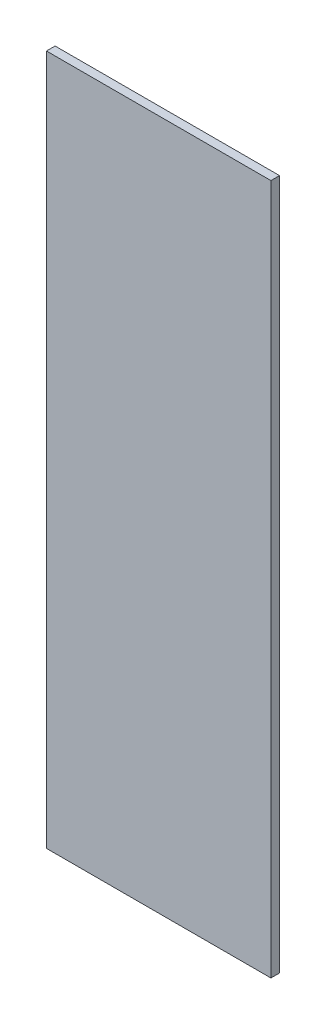
ISO-10303-21;
HEADER;
FILE_DESCRIPTION(('STEP AP214'),'2;1');
FILE_NAME('part.step','',(''),(''),'','','');
FILE_SCHEMA(('AUTOMOTIVE_DESIGN { 1 0 10303 214 1 1 1 1 }'));
ENDSEC;
DATA;
#1=APPLICATION_CONTEXT('core data for automotive mechanical design processes');
#2=APPLICATION_PROTOCOL_DEFINITION('international standard','automotive_design',2000,#1);
#3=PRODUCT_CONTEXT('',#1,'mechanical');
#4=PRODUCT('Part','Part','',(#3));
#5=PRODUCT_RELATED_PRODUCT_CATEGORY('part','',(#4));
#6=PRODUCT_DEFINITION_FORMATION('','',#4);
#7=PRODUCT_DEFINITION_CONTEXT('part definition',#1,'design');
#8=PRODUCT_DEFINITION('design','',#6,#7);
#9=PRODUCT_DEFINITION_SHAPE('','',#8);
#10=(LENGTH_UNIT() NAMED_UNIT(*) SI_UNIT(.MILLI.,.METRE.));
#11=(NAMED_UNIT(*) PLANE_ANGLE_UNIT() SI_UNIT($,.RADIAN.));
#12=(NAMED_UNIT(*) SI_UNIT($,.STERADIAN.) SOLID_ANGLE_UNIT());
#13=UNCERTAINTY_MEASURE_WITH_UNIT(LENGTH_MEASURE(1.E-05),#10,'distance_accuracy_value','');
#14=(GEOMETRIC_REPRESENTATION_CONTEXT(3) GLOBAL_UNCERTAINTY_ASSIGNED_CONTEXT((#13)) GLOBAL_UNIT_ASSIGNED_CONTEXT((#10,
#11,#12)) REPRESENTATION_CONTEXT('',''));
#15=CARTESIAN_POINT('',(0.,0.,0.));
#16=DIRECTION('',(0.,0.,1.));
#17=DIRECTION('',(1.,0.,0.));
#18=AXIS2_PLACEMENT_3D('',#15,#16,#17);
#19=CARTESIAN_POINT('',(-65.,-200.,5.));
#20=DIRECTION('',(1.,0.,0.));
#21=DIRECTION('',(0.,0.,-1.));
#22=AXIS2_PLACEMENT_3D('',#19,#20,#21);
#23=PLANE('',#22);
#24=DIRECTION('',(0.,-1.,0.));
#25=VECTOR('',#24,1.);
#26=CARTESIAN_POINT('',(-65.,-200.,0.));
#27=LINE('',#26,#25);
#28=CARTESIAN_POINT('',(-65.,200.,0.));
#29=VERTEX_POINT('',#28);
#30=CARTESIAN_POINT('',(-65.,-200.,0.));
#31=VERTEX_POINT('',#30);
#32=EDGE_CURVE('E100',#29,#31,#27,.T.);
#33=ORIENTED_EDGE('',*,*,#32,.T.);
#34=DIRECTION('',(0.,0.,-1.));
#35=VECTOR('',#34,1.);
#36=CARTESIAN_POINT('',(-65.,-200.,5.));
#37=LINE('',#36,#35);
#38=CARTESIAN_POINT('',(-65.,-200.,5.));
#39=VERTEX_POINT('',#38);
#40=EDGE_CURVE('E11',#39,#31,#37,.T.);
#41=ORIENTED_EDGE('',*,*,#40,.F.);
#42=DIRECTION('',(0.,-1.,0.));
#43=VECTOR('',#42,1.);
#44=CARTESIAN_POINT('',(-65.,-200.,5.));
#45=LINE('',#44,#43);
#46=CARTESIAN_POINT('',(-65.,200.,5.));
#47=VERTEX_POINT('',#46);
#48=EDGE_CURVE('E88',#47,#39,#45,.T.);
#49=ORIENTED_EDGE('',*,*,#48,.F.);
#50=DIRECTION('',(0.,0.,-1.));
#51=VECTOR('',#50,1.);
#52=CARTESIAN_POINT('',(-65.,200.,5.));
#53=LINE('',#52,#51);
#54=EDGE_CURVE('E96',#47,#29,#53,.T.);
#55=ORIENTED_EDGE('',*,*,#54,.T.);
#56=EDGE_LOOP('',(#33,#41,#49,#55));
#57=FACE_BOUND('',#56,.T.);
#58=ADVANCED_FACE('F37',(#57),#23,.F.);
#59=CARTESIAN_POINT('',(65.,-200.,5.));
#60=DIRECTION('',(0.,1.,0.));
#61=DIRECTION('',(0.,0.,1.));
#62=AXIS2_PLACEMENT_3D('',#59,#60,#61);
#63=PLANE('',#62);
#64=DIRECTION('',(1.,0.,0.));
#65=VECTOR('',#64,1.);
#66=CARTESIAN_POINT('',(65.,-200.,0.));
#67=LINE('',#66,#65);
#68=CARTESIAN_POINT('',(65.,-200.,0.));
#69=VERTEX_POINT('',#68);
#70=EDGE_CURVE('E92',#31,#69,#67,.T.);
#71=ORIENTED_EDGE('',*,*,#70,.T.);
#72=DIRECTION('',(0.,0.,-1.));
#73=VECTOR('',#72,1.);
#74=CARTESIAN_POINT('',(65.,-200.,5.));
#75=LINE('',#74,#73);
#76=CARTESIAN_POINT('',(65.,-200.,5.));
#77=VERTEX_POINT('',#76);
#78=EDGE_CURVE('E45',#77,#69,#75,.T.);
#79=ORIENTED_EDGE('',*,*,#78,.F.);
#80=DIRECTION('',(1.,0.,0.));
#81=VECTOR('',#80,1.);
#82=CARTESIAN_POINT('',(65.,-200.,5.));
#83=LINE('',#82,#81);
#84=EDGE_CURVE('E83',#39,#77,#83,.T.);
#85=ORIENTED_EDGE('',*,*,#84,.F.);
#86=ORIENTED_EDGE('',*,*,#40,.T.);
#87=EDGE_LOOP('',(#71,#79,#85,#86));
#88=FACE_BOUND('',#87,.T.);
#89=ADVANCED_FACE('F91',(#88),#63,.F.);
#90=CARTESIAN_POINT('',(65.,-200.,5.));
#91=DIRECTION('',(-1.,0.,0.));
#92=DIRECTION('',(0.,0.,1.));
#93=AXIS2_PLACEMENT_3D('',#90,#91,#92);
#94=PLANE('',#93);
#95=DIRECTION('',(0.,1.,0.));
#96=VECTOR('',#95,1.);
#97=CARTESIAN_POINT('',(65.,-200.,0.));
#98=LINE('',#97,#96);
#99=CARTESIAN_POINT('',(65.,200.,0.));
#100=VERTEX_POINT('',#99);
#101=EDGE_CURVE('E70',#69,#100,#98,.T.);
#102=ORIENTED_EDGE('',*,*,#101,.T.);
#103=DIRECTION('',(0.,0.,-1.));
#104=VECTOR('',#103,1.);
#105=CARTESIAN_POINT('',(65.,200.,5.));
#106=LINE('',#105,#104);
#107=CARTESIAN_POINT('',(65.,200.,5.));
#108=VERTEX_POINT('',#107);
#109=EDGE_CURVE('E93',#108,#100,#106,.T.);
#110=ORIENTED_EDGE('',*,*,#109,.F.);
#111=DIRECTION('',(0.,1.,0.));
#112=VECTOR('',#111,1.);
#113=CARTESIAN_POINT('',(65.,-200.,5.));
#114=LINE('',#113,#112);
#115=EDGE_CURVE('E86',#77,#108,#114,.T.);
#116=ORIENTED_EDGE('',*,*,#115,.F.);
#117=ORIENTED_EDGE('',*,*,#78,.T.);
#118=EDGE_LOOP('',(#102,#110,#116,#117));
#119=FACE_BOUND('',#118,.T.);
#120=ADVANCED_FACE('F94',(#119),#94,.F.);
#121=CARTESIAN_POINT('',(65.,200.,5.));
#122=DIRECTION('',(0.,-1.,0.));
#123=DIRECTION('',(0.,0.,-1.));
#124=AXIS2_PLACEMENT_3D('',#121,#122,#123);
#125=PLANE('',#124);
#126=DIRECTION('',(-1.,0.,0.));
#127=VECTOR('',#126,1.);
#128=CARTESIAN_POINT('',(65.,200.,0.));
#129=LINE('',#128,#127);
#130=EDGE_CURVE('E76',#100,#29,#129,.T.);
#131=ORIENTED_EDGE('',*,*,#130,.T.);
#132=ORIENTED_EDGE('',*,*,#54,.F.);
#133=DIRECTION('',(-1.,0.,0.));
#134=VECTOR('',#133,1.);
#135=CARTESIAN_POINT('',(65.,200.,5.));
#136=LINE('',#135,#134);
#137=EDGE_CURVE('E53',#108,#47,#136,.T.);
#138=ORIENTED_EDGE('',*,*,#137,.F.);
#139=ORIENTED_EDGE('',*,*,#109,.T.);
#140=EDGE_LOOP('',(#131,#132,#138,#139));
#141=FACE_BOUND('',#140,.T.);
#142=ADVANCED_FACE('F107',(#141),#125,.F.);
#143=CARTESIAN_POINT('',(0.,0.,5.));
#144=DIRECTION('',(0.,0.,1.));
#145=DIRECTION('',(1.,0.,0.));
#146=AXIS2_PLACEMENT_3D('',#143,#144,#145);
#147=PLANE('',#146);
#148=ORIENTED_EDGE('',*,*,#48,.T.);
#149=ORIENTED_EDGE('',*,*,#84,.T.);
#150=ORIENTED_EDGE('',*,*,#115,.T.);
#151=ORIENTED_EDGE('',*,*,#137,.T.);
#152=EDGE_LOOP('',(#148,#149,#150,#151));
#153=FACE_BOUND('',#152,.T.);
#154=ADVANCED_FACE('F84',(#153),#147,.T.);
#155=CARTESIAN_POINT('',(0.,0.,0.));
#156=DIRECTION('',(0.,0.,1.));
#157=DIRECTION('',(1.,0.,0.));
#158=AXIS2_PLACEMENT_3D('',#155,#156,#157);
#159=PLANE('',#158);
#160=ORIENTED_EDGE('',*,*,#32,.F.);
#161=ORIENTED_EDGE('',*,*,#130,.F.);
#162=ORIENTED_EDGE('',*,*,#101,.F.);
#163=ORIENTED_EDGE('',*,*,#70,.F.);
#164=EDGE_LOOP('',(#160,#161,#162,#163));
#165=FACE_BOUND('',#164,.T.);
#166=ADVANCED_FACE('F110',(#165),#159,.F.);
#167=CLOSED_SHELL('',(#58,#89,#120,#142,#154,#166));
#168=MANIFOLD_SOLID_BREP('B2',#167);
#169=ADVANCED_BREP_SHAPE_REPRESENTATION('',(#18,#168),#14);
#170=SHAPE_DEFINITION_REPRESENTATION(#9,#169);
ENDSEC;
END-ISO-10303-21;
